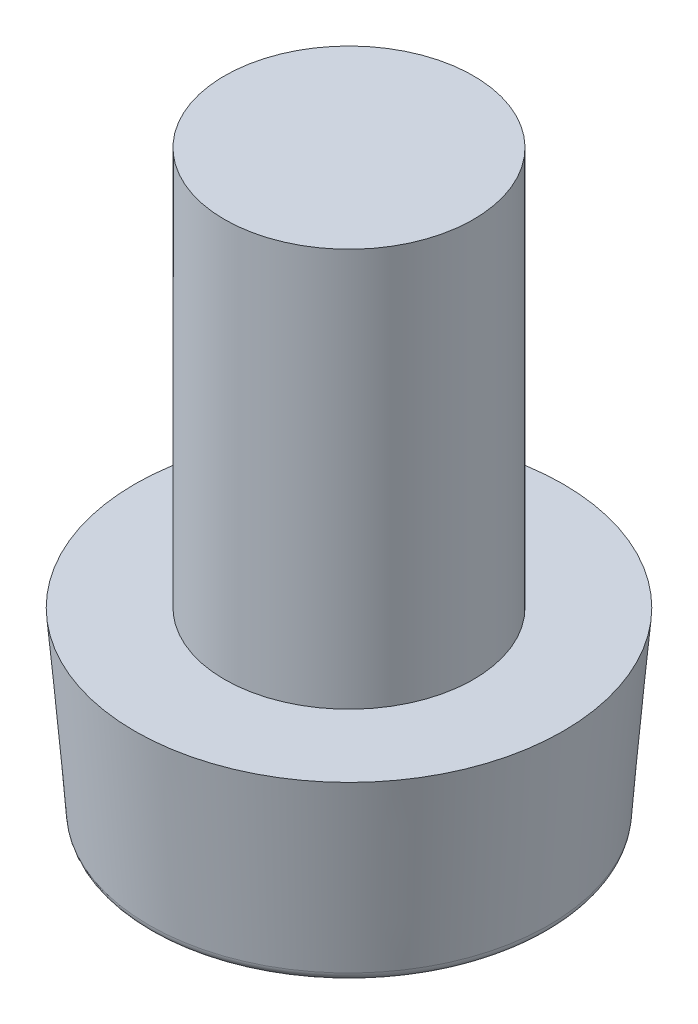
ISO-10303-21;
HEADER;
FILE_DESCRIPTION(('STEP AP214'),'2;1');
FILE_NAME('part.step','',(''),(''),'','','');
FILE_SCHEMA(('AUTOMOTIVE_DESIGN { 1 0 10303 214 1 1 1 1 }'));
ENDSEC;
DATA;
#1=APPLICATION_CONTEXT('core data for automotive mechanical design processes');
#2=APPLICATION_PROTOCOL_DEFINITION('international standard','automotive_design',2000,#1);
#3=PRODUCT_CONTEXT('',#1,'mechanical');
#4=PRODUCT('Part','Part','',(#3));
#5=PRODUCT_RELATED_PRODUCT_CATEGORY('part','',(#4));
#6=PRODUCT_DEFINITION_FORMATION('','',#4);
#7=PRODUCT_DEFINITION_CONTEXT('part definition',#1,'design');
#8=PRODUCT_DEFINITION('design','',#6,#7);
#9=PRODUCT_DEFINITION_SHAPE('','',#8);
#10=(LENGTH_UNIT() NAMED_UNIT(*) SI_UNIT(.MILLI.,.METRE.));
#11=(NAMED_UNIT(*) PLANE_ANGLE_UNIT() SI_UNIT($,.RADIAN.));
#12=(NAMED_UNIT(*) SI_UNIT($,.STERADIAN.) SOLID_ANGLE_UNIT());
#13=UNCERTAINTY_MEASURE_WITH_UNIT(LENGTH_MEASURE(1.E-05),#10,'distance_accuracy_value','');
#14=(GEOMETRIC_REPRESENTATION_CONTEXT(3) GLOBAL_UNCERTAINTY_ASSIGNED_CONTEXT((#13)) GLOBAL_UNIT_ASSIGNED_CONTEXT((#10,
#11,#12)) REPRESENTATION_CONTEXT('',''));
#15=CARTESIAN_POINT('',(0.,0.,0.));
#16=DIRECTION('',(0.,0.,1.));
#17=DIRECTION('',(1.,0.,0.));
#18=AXIS2_PLACEMENT_3D('',#15,#16,#17);
#19=CARTESIAN_POINT('',(0.,1.85,0.));
#20=DIRECTION('',(0.,1.,0.));
#21=DIRECTION('',(0.,0.,1.));
#22=AXIS2_PLACEMENT_3D('',#19,#20,#21);
#23=PLANE('',#22);
#24=CARTESIAN_POINT('',(0.,1.85,0.));
#25=DIRECTION('',(0.,1.,0.));
#26=DIRECTION('',(0.,0.,1.));
#27=AXIS2_PLACEMENT_3D('',#24,#25,#26);
#28=CIRCLE('',#27,1.25);
#29=CARTESIAN_POINT('',(0.,1.85,1.25));
#30=VERTEX_POINT('',#29);
#31=EDGE_CURVE('E50',#30,#30,#28,.T.);
#32=ORIENTED_EDGE('',*,*,#31,.F.);
#33=EDGE_LOOP('',(#32));
#34=FACE_BOUND('',#33,.T.);
#35=CARTESIAN_POINT('',(0.,1.85,0.));
#36=DIRECTION('',(0.,1.,0.));
#37=DIRECTION('',(0.,0.,1.));
#38=AXIS2_PLACEMENT_3D('',#35,#36,#37);
#39=CIRCLE('',#38,2.15);
#40=CARTESIAN_POINT('',(0.,1.85,2.15));
#41=VERTEX_POINT('',#40);
#42=EDGE_CURVE('E55',#41,#41,#39,.T.);
#43=ORIENTED_EDGE('',*,*,#42,.T.);
#44=EDGE_LOOP('',(#43));
#45=FACE_BOUND('',#44,.T.);
#46=ADVANCED_FACE('F37',(#34,#45),#23,.T.);
#47=CARTESIAN_POINT('',(0.,0.,0.));
#48=DIRECTION('',(0.,1.,0.));
#49=DIRECTION('',(0.,0.,1.));
#50=AXIS2_PLACEMENT_3D('',#47,#48,#49);
#51=PLANE('',#50);
#52=CARTESIAN_POINT('',(0.,0.,0.));
#53=DIRECTION('',(0.,1.,0.));
#54=DIRECTION('',(0.,0.,1.));
#55=AXIS2_PLACEMENT_3D('',#52,#53,#54);
#56=CIRCLE('',#55,1.90777993949584);
#57=CARTESIAN_POINT('',(0.,0.,1.90777993949584));
#58=VERTEX_POINT('',#57);
#59=EDGE_CURVE('E45',#58,#58,#56,.F.);
#60=ORIENTED_EDGE('',*,*,#59,.T.);
#61=EDGE_LOOP('',(#60));
#62=FACE_BOUND('',#61,.T.);
#63=ADVANCED_FACE('F71',(#62),#51,.F.);
#64=CARTESIAN_POINT('',(0.,5.85,0.));
#65=DIRECTION('',(0.,-1.,0.));
#66=DIRECTION('',(0.,0.,-1.));
#67=AXIS2_PLACEMENT_3D('',#64,#65,#66);
#68=CYLINDRICAL_SURFACE('',#67,1.25);
#69=CARTESIAN_POINT('',(0.,5.85,0.));
#70=DIRECTION('',(0.,1.,0.));
#71=DIRECTION('',(0.,0.,1.));
#72=AXIS2_PLACEMENT_3D('',#69,#70,#71);
#73=CIRCLE('',#72,1.25);
#74=CARTESIAN_POINT('',(0.,5.85,1.25));
#75=VERTEX_POINT('',#74);
#76=EDGE_CURVE('E60',#75,#75,#73,.T.);
#77=ORIENTED_EDGE('',*,*,#76,.F.);
#78=EDGE_LOOP('',(#77));
#79=FACE_BOUND('',#78,.T.);
#80=ORIENTED_EDGE('',*,*,#31,.T.);
#81=EDGE_LOOP('',(#80));
#82=FACE_BOUND('',#81,.T.);
#83=ADVANCED_FACE('F68',(#79,#82),#68,.T.);
#84=CARTESIAN_POINT('',(0.,5.85,0.));
#85=DIRECTION('',(0.,1.,0.));
#86=DIRECTION('',(0.,0.,1.));
#87=AXIS2_PLACEMENT_3D('',#84,#85,#86);
#88=PLANE('',#87);
#89=ORIENTED_EDGE('',*,*,#76,.T.);
#90=EDGE_LOOP('',(#89));
#91=FACE_BOUND('',#90,.T.);
#92=ADVANCED_FACE('F66',(#91),#88,.T.);
#93=CARTESIAN_POINT('',(0.,1.85000000000005,0.));
#94=DIRECTION('',(0.,1.,0.));
#95=DIRECTION('',(0.,0.,1.));
#96=AXIS2_PLACEMENT_3D('',#93,#94,#95);
#97=CONICAL_SURFACE('',#96,2.15,0.080904099155227);
#98=CARTESIAN_POINT('',(0.,0.0919184131233949,0.));
#99=DIRECTION('',(0.,1.,0.));
#100=DIRECTION('',(0.,0.,1.));
#101=AXIS2_PLACEMENT_3D('',#98,#99,#100);
#102=CIRCLE('',#101,2.0074528443073);
#103=CARTESIAN_POINT('',(0.,0.0919184131233949,2.0074528443073));
#104=VERTEX_POINT('',#103);
#105=EDGE_CURVE('E10',#104,#104,#102,.T.);
#106=ORIENTED_EDGE('',*,*,#105,.T.);
#107=EDGE_LOOP('',(#106));
#108=FACE_BOUND('',#107,.T.);
#109=ORIENTED_EDGE('',*,*,#42,.F.);
#110=EDGE_LOOP('',(#109));
#111=FACE_BOUND('',#110,.T.);
#112=ADVANCED_FACE('F80',(#108,#111),#97,.T.);
#113=CARTESIAN_POINT('',(0.,0.1,0.));
#114=DIRECTION('',(0.,1.,0.));
#115=DIRECTION('',(0.,0.,1.));
#116=AXIS2_PLACEMENT_3D('',#113,#114,#115);
#117=TOROIDAL_SURFACE('',#116,1.90777993949584,0.1);
#118=ORIENTED_EDGE('',*,*,#105,.F.);
#119=EDGE_LOOP('',(#118));
#120=FACE_BOUND('',#119,.T.);
#121=ORIENTED_EDGE('',*,*,#59,.F.);
#122=EDGE_LOOP('',(#121));
#123=FACE_BOUND('',#122,.T.);
#124=ADVANCED_FACE('F39',(#120,#123),#117,.T.);
#125=CLOSED_SHELL('',(#46,#63,#83,#92,#112,#124));
#126=MANIFOLD_SOLID_BREP('B2',#125);
#127=ADVANCED_BREP_SHAPE_REPRESENTATION('',(#18,#126),#14);
#128=SHAPE_DEFINITION_REPRESENTATION(#9,#127);
ENDSEC;
END-ISO-10303-21;
